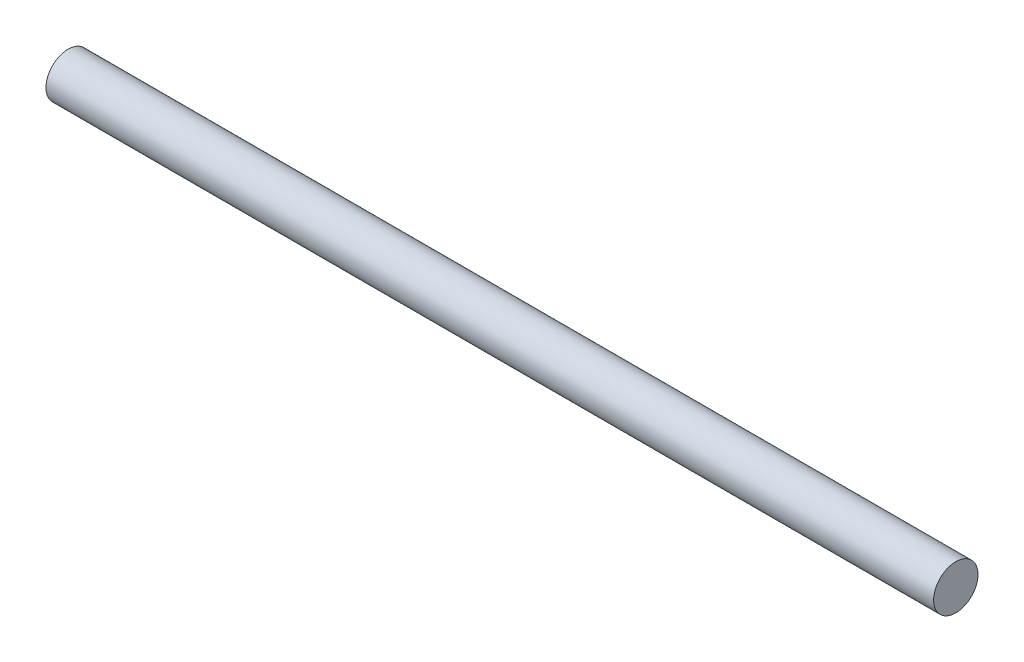
ISO-10303-21;
HEADER;
FILE_DESCRIPTION(('STEP AP214'),'2;1');
FILE_NAME('part.step','',(''),(''),'','','');
FILE_SCHEMA(('AUTOMOTIVE_DESIGN { 1 0 10303 214 1 1 1 1 }'));
ENDSEC;
DATA;
#1=APPLICATION_CONTEXT('core data for automotive mechanical design processes');
#2=APPLICATION_PROTOCOL_DEFINITION('international standard','automotive_design',2000,#1);
#3=PRODUCT_CONTEXT('',#1,'mechanical');
#4=PRODUCT('Part','Part','',(#3));
#5=PRODUCT_RELATED_PRODUCT_CATEGORY('part','',(#4));
#6=PRODUCT_DEFINITION_FORMATION('','',#4);
#7=PRODUCT_DEFINITION_CONTEXT('part definition',#1,'design');
#8=PRODUCT_DEFINITION('design','',#6,#7);
#9=PRODUCT_DEFINITION_SHAPE('','',#8);
#10=(LENGTH_UNIT() NAMED_UNIT(*) SI_UNIT(.MILLI.,.METRE.));
#11=(NAMED_UNIT(*) PLANE_ANGLE_UNIT() SI_UNIT($,.RADIAN.));
#12=(NAMED_UNIT(*) SI_UNIT($,.STERADIAN.) SOLID_ANGLE_UNIT());
#13=UNCERTAINTY_MEASURE_WITH_UNIT(LENGTH_MEASURE(1.E-05),#10,'distance_accuracy_value','');
#14=(GEOMETRIC_REPRESENTATION_CONTEXT(3) GLOBAL_UNCERTAINTY_ASSIGNED_CONTEXT((#13)) GLOBAL_UNIT_ASSIGNED_CONTEXT((#10,
#11,#12)) REPRESENTATION_CONTEXT('',''));
#15=CARTESIAN_POINT('',(0.,0.,0.));
#16=DIRECTION('',(0.,0.,1.));
#17=DIRECTION('',(1.,0.,0.));
#18=AXIS2_PLACEMENT_3D('',#15,#16,#17);
#19=CARTESIAN_POINT('',(254.,-2.70433109439643,2.58502236964365));
#20=DIRECTION('',(-1.,0.,0.));
#21=DIRECTION('',(0.,0.,1.));
#22=AXIS2_PLACEMENT_3D('',#19,#20,#21);
#23=CYLINDRICAL_SURFACE('',#22,6.35);
#24=CARTESIAN_POINT('',(254.,-2.70433109439643,2.58502236964365));
#25=DIRECTION('',(1.,0.,0.));
#26=DIRECTION('',(0.,0.,-1.));
#27=AXIS2_PLACEMENT_3D('',#24,#25,#26);
#28=CIRCLE('',#27,6.35);
#29=CARTESIAN_POINT('',(254.,-2.70433109439643,-3.76497763035635));
#30=VERTEX_POINT('',#29);
#31=EDGE_CURVE('E10',#30,#30,#28,.T.);
#32=ORIENTED_EDGE('',*,*,#31,.F.);
#33=EDGE_LOOP('',(#32));
#34=FACE_BOUND('',#33,.T.);
#35=CARTESIAN_POINT('',(0.,-2.70433109439643,2.58502236964365));
#36=DIRECTION('',(1.,0.,0.));
#37=DIRECTION('',(0.,0.,-1.));
#38=AXIS2_PLACEMENT_3D('',#35,#36,#37);
#39=CIRCLE('',#38,6.35);
#40=CARTESIAN_POINT('',(0.,-2.70433109439643,-3.76497763035635));
#41=VERTEX_POINT('',#40);
#42=EDGE_CURVE('E46',#41,#41,#39,.T.);
#43=ORIENTED_EDGE('',*,*,#42,.T.);
#44=EDGE_LOOP('',(#43));
#45=FACE_BOUND('',#44,.T.);
#46=ADVANCED_FACE('F43',(#34,#45),#23,.T.);
#47=CARTESIAN_POINT('',(254.,-2.70433109439643,2.58502236964365));
#48=DIRECTION('',(1.,0.,0.));
#49=DIRECTION('',(0.,0.,-1.));
#50=AXIS2_PLACEMENT_3D('',#47,#48,#49);
#51=PLANE('',#50);
#52=ORIENTED_EDGE('',*,*,#31,.T.);
#53=EDGE_LOOP('',(#52));
#54=FACE_BOUND('',#53,.T.);
#55=ADVANCED_FACE('F60',(#54),#51,.T.);
#56=CARTESIAN_POINT('',(0.,-2.70433109439643,2.58502236964365));
#57=DIRECTION('',(1.,0.,0.));
#58=DIRECTION('',(0.,0.,-1.));
#59=AXIS2_PLACEMENT_3D('',#56,#57,#58);
#60=PLANE('',#59);
#61=ORIENTED_EDGE('',*,*,#42,.F.);
#62=EDGE_LOOP('',(#61));
#63=FACE_BOUND('',#62,.T.);
#64=ADVANCED_FACE('F58',(#63),#60,.F.);
#65=CLOSED_SHELL('',(#46,#55,#64));
#66=MANIFOLD_SOLID_BREP('B2',#65);
#67=ADVANCED_BREP_SHAPE_REPRESENTATION('',(#18,#66),#14);
#68=SHAPE_DEFINITION_REPRESENTATION(#9,#67);
ENDSEC;
END-ISO-10303-21;
